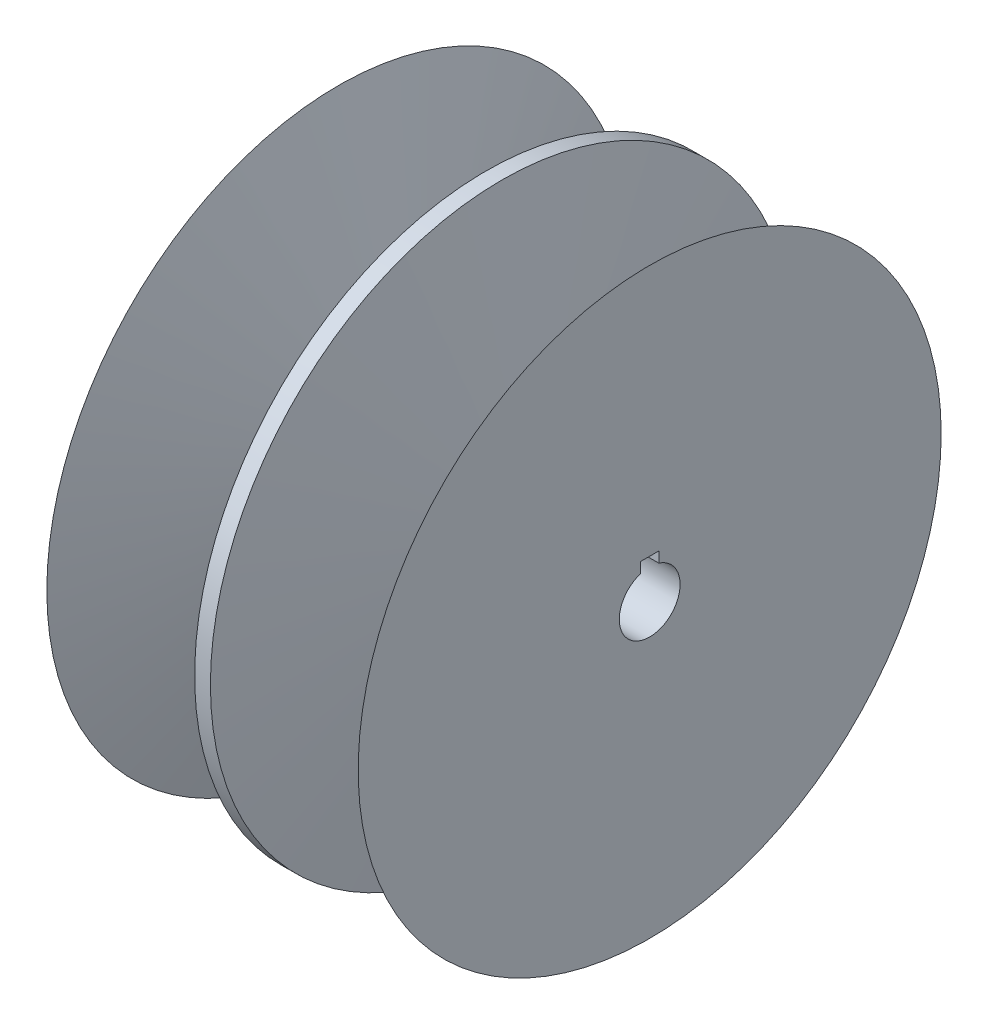
ISO-10303-21;
HEADER;
FILE_DESCRIPTION(('STEP AP214'),'2;1');
FILE_NAME('part.step','',(''),(''),'','','');
FILE_SCHEMA(('AUTOMOTIVE_DESIGN { 1 0 10303 214 1 1 1 1 }'));
ENDSEC;
DATA;
#1=APPLICATION_CONTEXT('core data for automotive mechanical design processes');
#2=APPLICATION_PROTOCOL_DEFINITION('international standard','automotive_design',2000,#1);
#3=PRODUCT_CONTEXT('',#1,'mechanical');
#4=PRODUCT('Part','Part','',(#3));
#5=PRODUCT_RELATED_PRODUCT_CATEGORY('part','',(#4));
#6=PRODUCT_DEFINITION_FORMATION('','',#4);
#7=PRODUCT_DEFINITION_CONTEXT('part definition',#1,'design');
#8=PRODUCT_DEFINITION('design','',#6,#7);
#9=PRODUCT_DEFINITION_SHAPE('','',#8);
#10=(LENGTH_UNIT() NAMED_UNIT(*) SI_UNIT(.MILLI.,.METRE.));
#11=(NAMED_UNIT(*) PLANE_ANGLE_UNIT() SI_UNIT($,.RADIAN.));
#12=(NAMED_UNIT(*) SI_UNIT($,.STERADIAN.) SOLID_ANGLE_UNIT());
#13=UNCERTAINTY_MEASURE_WITH_UNIT(LENGTH_MEASURE(1.E-05),#10,'distance_accuracy_value','');
#14=(GEOMETRIC_REPRESENTATION_CONTEXT(3) GLOBAL_UNCERTAINTY_ASSIGNED_CONTEXT((#13)) GLOBAL_UNIT_ASSIGNED_CONTEXT((#10,
#11,#12)) REPRESENTATION_CONTEXT('',''));
#15=CARTESIAN_POINT('',(0.,0.,0.));
#16=DIRECTION('',(0.,0.,1.));
#17=DIRECTION('',(1.,0.,0.));
#18=AXIS2_PLACEMENT_3D('',#15,#16,#17);
#19=CARTESIAN_POINT('',(40.64,0.,0.));
#20=DIRECTION('',(1.,0.,0.));
#21=DIRECTION('',(0.,0.,-1.));
#22=AXIS2_PLACEMENT_3D('',#19,#20,#21);
#23=PLANE('',#22);
#24=CARTESIAN_POINT('',(40.64,0.,0.));
#25=DIRECTION('',(1.,0.,0.));
#26=DIRECTION('',(0.,0.,-1.));
#27=AXIS2_PLACEMENT_3D('',#24,#25,#26);
#28=CIRCLE('',#27,7.9375);
#29=CARTESIAN_POINT('',(40.64,7.57189241124701,2.38125));
#30=VERTEX_POINT('',#29);
#31=CARTESIAN_POINT('',(40.64,7.57189241124701,-2.38125));
#32=VERTEX_POINT('',#31);
#33=EDGE_CURVE('E57',#30,#32,#28,.T.);
#34=ORIENTED_EDGE('',*,*,#33,.F.);
#35=DIRECTION('',(0.,1.,0.));
#36=VECTOR('',#35,1.);
#37=CARTESIAN_POINT('',(40.64,0.,2.38125));
#38=LINE('',#37,#36);
#39=CARTESIAN_POINT('',(40.64,10.31875,2.38125));
#40=VERTEX_POINT('',#39);
#41=EDGE_CURVE('E100',#30,#40,#38,.T.);
#42=ORIENTED_EDGE('',*,*,#41,.T.);
#43=DIRECTION('',(0.,0.,1.));
#44=VECTOR('',#43,1.);
#45=CARTESIAN_POINT('',(40.64,10.31875,0.));
#46=LINE('',#45,#44);
#47=CARTESIAN_POINT('',(40.64,10.31875,-2.38125));
#48=VERTEX_POINT('',#47);
#49=EDGE_CURVE('E85',#48,#40,#46,.T.);
#50=ORIENTED_EDGE('',*,*,#49,.F.);
#51=DIRECTION('',(0.,1.,0.));
#52=VECTOR('',#51,1.);
#53=CARTESIAN_POINT('',(40.64,0.,-2.38125));
#54=LINE('',#53,#52);
#55=EDGE_CURVE('E94',#32,#48,#54,.T.);
#56=ORIENTED_EDGE('',*,*,#55,.F.);
#57=EDGE_LOOP('',(#34,#42,#50,#56));
#58=FACE_BOUND('',#57,.T.);
#59=CARTESIAN_POINT('',(40.64,0.,0.));
#60=DIRECTION('',(1.,0.,0.));
#61=DIRECTION('',(0.,0.,-1.));
#62=AXIS2_PLACEMENT_3D('',#59,#60,#61);
#63=CIRCLE('',#62,76.09205);
#64=CARTESIAN_POINT('',(40.64,0.,-76.09205));
#65=VERTEX_POINT('',#64);
#66=EDGE_CURVE('E112',#65,#65,#63,.T.);
#67=ORIENTED_EDGE('',*,*,#66,.T.);
#68=EDGE_LOOP('',(#67));
#69=FACE_BOUND('',#68,.T.);
#70=ADVANCED_FACE('F43',(#58,#69),#23,.T.);
#71=CARTESIAN_POINT('',(40.64,0.,0.));
#72=DIRECTION('',(1.,0.,0.));
#73=DIRECTION('',(0.,0.,-1.));
#74=AXIS2_PLACEMENT_3D('',#71,#72,#73);
#75=CONICAL_SURFACE('',#74,76.09205,1.28500702817278);
#76=CARTESIAN_POINT('',(22.0133333333333,0.,0.));
#77=DIRECTION('',(1.,0.,0.));
#78=DIRECTION('',(0.,0.,-1.));
#79=AXIS2_PLACEMENT_3D('',#76,#77,#78);
#80=CIRCLE('',#79,12.7);
#81=CARTESIAN_POINT('',(22.0133333333333,0.,-12.7));
#82=VERTEX_POINT('',#81);
#83=EDGE_CURVE('E107',#82,#82,#80,.T.);
#84=CARTESIAN_POINT('',(22.0133333333333,0.,-12.7));
#85=CARTESIAN_POINT('',(22.2073611111111,0.,-13.3603338541666));
#86=CARTESIAN_POINT('',(22.4013888888889,0.,-14.0206677083333));
#87=CARTESIAN_POINT('',(22.7894444444444,0.,-15.3413354166666));
#88=CARTESIAN_POINT('',(22.9834722222222,0.,-16.0016692708333));
#89=CARTESIAN_POINT('',(23.3715277777778,0.,-17.3223369791666));
#90=CARTESIAN_POINT('',(23.5655555555556,0.,-17.9826708333333));
#91=CARTESIAN_POINT('',(23.9536111111111,0.,-19.3033385416666));
#92=CARTESIAN_POINT('',(24.1476388888889,0.,-19.9636723958333));
#93=CARTESIAN_POINT('',(24.5356944444444,0.,-21.2843401041666));
#94=CARTESIAN_POINT('',(24.7297222222222,0.,-21.9446739583333));
#95=CARTESIAN_POINT('',(25.1177777777778,0.,-23.2653416666666));
#96=CARTESIAN_POINT('',(25.3118055555556,0.,-23.9256755208333));
#97=CARTESIAN_POINT('',(25.6998611111111,0.,-25.2463432291666));
#98=CARTESIAN_POINT('',(25.8938888888889,0.,-25.9066770833333));
#99=CARTESIAN_POINT('',(26.2819444444444,0.,-27.2273447916666));
#100=CARTESIAN_POINT('',(26.4759722222222,0.,-27.8876786458333));
#101=CARTESIAN_POINT('',(26.8640277777778,0.,-29.2083463541666));
#102=CARTESIAN_POINT('',(27.0580555555556,0.,-29.8686802083333));
#103=CARTESIAN_POINT('',(27.4461111111111,0.,-31.1893479166666));
#104=CARTESIAN_POINT('',(27.6401388888889,0.,-31.8496817708333));
#105=CARTESIAN_POINT('',(28.0281944444444,0.,-33.1703494791666));
#106=CARTESIAN_POINT('',(28.2222222222222,0.,-33.8306833333333));
#107=CARTESIAN_POINT('',(28.6102777777778,0.,-35.1513510416666));
#108=CARTESIAN_POINT('',(28.8043055555556,0.,-35.8116848958333));
#109=CARTESIAN_POINT('',(29.1923611111111,0.,-37.1323526041666));
#110=CARTESIAN_POINT('',(29.3863888888889,0.,-37.7926864583333));
#111=CARTESIAN_POINT('',(29.7744444444444,0.,-39.1133541666666));
#112=CARTESIAN_POINT('',(29.9684722222222,0.,-39.7736880208333));
#113=CARTESIAN_POINT('',(30.3565277777778,0.,-41.0943557291666));
#114=CARTESIAN_POINT('',(30.5505555555556,0.,-41.7546895833333));
#115=CARTESIAN_POINT('',(30.9386111111111,0.,-43.0753572916666));
#116=CARTESIAN_POINT('',(31.1326388888889,0.,-43.7356911458333));
#117=CARTESIAN_POINT('',(31.5206944444444,0.,-45.0563588541666));
#118=CARTESIAN_POINT('',(31.7147222222222,0.,-45.7166927083333));
#119=CARTESIAN_POINT('',(32.1027777777778,0.,-47.0373604166666));
#120=CARTESIAN_POINT('',(32.2968055555556,0.,-47.6976942708333));
#121=CARTESIAN_POINT('',(32.6848611111111,0.,-49.0183619791666));
#122=CARTESIAN_POINT('',(32.8788888888889,0.,-49.6786958333333));
#123=CARTESIAN_POINT('',(33.2669444444444,0.,-50.9993635416666));
#124=CARTESIAN_POINT('',(33.4609722222222,0.,-51.6596973958333));
#125=CARTESIAN_POINT('',(33.8490277777778,0.,-52.9803651041666));
#126=CARTESIAN_POINT('',(34.0430555555556,0.,-53.6406989583333));
#127=CARTESIAN_POINT('',(34.4311111111111,0.,-54.9613666666666));
#128=CARTESIAN_POINT('',(34.6251388888889,0.,-55.6217005208333));
#129=CARTESIAN_POINT('',(35.0131944444444,0.,-56.9423682291666));
#130=CARTESIAN_POINT('',(35.2072222222222,0.,-57.6027020833333));
#131=CARTESIAN_POINT('',(35.5952777777778,0.,-58.9233697916666));
#132=CARTESIAN_POINT('',(35.7893055555556,0.,-59.5837036458333));
#133=CARTESIAN_POINT('',(36.1773611111111,0.,-60.9043713541666));
#134=CARTESIAN_POINT('',(36.3713888888889,0.,-61.5647052083333));
#135=CARTESIAN_POINT('',(36.7594444444444,0.,-62.8853729166666));
#136=CARTESIAN_POINT('',(36.9534722222222,0.,-63.5457067708333));
#137=CARTESIAN_POINT('',(37.3415277777778,0.,-64.8663744791666));
#138=CARTESIAN_POINT('',(37.5355555555556,0.,-65.5267083333333));
#139=CARTESIAN_POINT('',(37.9236111111111,0.,-66.8473760416666));
#140=CARTESIAN_POINT('',(38.1176388888889,0.,-67.5077098958333));
#141=CARTESIAN_POINT('',(38.5056944444444,0.,-68.8283776041666));
#142=CARTESIAN_POINT('',(38.6997222222222,0.,-69.4887114583333));
#143=CARTESIAN_POINT('',(39.0877777777778,0.,-70.8093791666666));
#144=CARTESIAN_POINT('',(39.2818055555556,0.,-71.4697130208333));
#145=CARTESIAN_POINT('',(39.6698611111111,0.,-72.7903807291666));
#146=CARTESIAN_POINT('',(39.8638888888889,0.,-73.4507145833333));
#147=CARTESIAN_POINT('',(40.2519444444444,0.,-74.7713822916666));
#148=CARTESIAN_POINT('',(40.4459722222222,0.,-75.4317161458333));
#149=CARTESIAN_POINT('',(40.64,0.,-76.09205));
#150=B_SPLINE_CURVE_WITH_KNOTS('',3,(#84,#85,#86,#87,#88,#89,#90,#91,#92,#93,#94,#95,#96,#97,
#98,#99,#100,#101,#102,#103,#104,#105,#106,#107,#108,#109,#110,#111,#112,#113,#114,#115,#116,
#117,#118,#119,#120,#121,#122,#123,#124,#125,#126,#127,#128,#129,#130,#131,#132,#133,#134,#135,
#136,#137,#138,#139,#140,#141,#142,#143,#144,#145,#146,#147,#148,#149),.UNSPECIFIED.,.F.,.F.,(4,
2,2,2,2,2,2,2,2,2,2,2,2,2,2,2,2,2,2,2,2,2,2,2,2,2,2,2,2,2,2,2,4),(0.,2.06474894298844,
4.12949788597689,6.19424682896533,8.25899577195378,10.3237447149422,12.3884936579307,
14.4532426009191,16.5179915439075,18.582740486896,20.6474894298844,22.7122383728729,
24.7769873158613,26.8417362588498,28.9064852018382,30.9712341448266,33.0359830878151,
35.1007320308035,37.165480973792,39.2302299167804,41.2949788597688,43.3597278027573,
45.4244767457457,47.4892256887342,49.5539746317226,51.618723574711,53.6834725176995,
55.7482214606879,57.8129704036764,59.8777193466648,61.9424682896533,64.0072172326417,
66.0719661756302),.UNSPECIFIED.);
#151=EDGE_CURVE('BSEAM133',#82,#65,#150,.T.);
#152=ORIENTED_EDGE('',*,*,#83,.T.);
#153=ORIENTED_EDGE('',*,*,#66,.F.);
#154=ORIENTED_EDGE('',*,*,#151,.T.);
#155=ORIENTED_EDGE('',*,*,#151,.F.);
#156=EDGE_LOOP('',(#152,#154,#153,#155));
#157=FACE_BOUND('',#156,.T.);
#158=ADVANCED_FACE('F133',(#157),#75,.T.);
#159=CARTESIAN_POINT('',(22.0133333333333,0.,0.));
#160=DIRECTION('',(-1.,0.,0.));
#161=DIRECTION('',(0.,0.,1.));
#162=AXIS2_PLACEMENT_3D('',#159,#160,#161);
#163=PLANE('',#162);
#164=CARTESIAN_POINT('',(22.0133333333333,0.,0.));
#165=DIRECTION('',(-1.,0.,0.));
#166=DIRECTION('',(0.,0.,1.));
#167=AXIS2_PLACEMENT_3D('',#164,#165,#166);
#168=CIRCLE('',#167,7.9375);
#169=CARTESIAN_POINT('',(22.0133333333333,7.57189241124701,-2.38125));
#170=VERTEX_POINT('',#169);
#171=CARTESIAN_POINT('',(22.0133333333333,7.57189241124701,2.38125));
#172=VERTEX_POINT('',#171);
#173=EDGE_CURVE('E12',#170,#172,#168,.T.);
#174=ORIENTED_EDGE('',*,*,#173,.F.);
#175=DIRECTION('',(0.,-1.,0.));
#176=VECTOR('',#175,1.);
#177=CARTESIAN_POINT('',(22.0133333333333,0.,-2.38125));
#178=LINE('',#177,#176);
#179=CARTESIAN_POINT('',(22.0133333333333,10.31875,-2.38125));
#180=VERTEX_POINT('',#179);
#181=EDGE_CURVE('E115',#180,#170,#178,.T.);
#182=ORIENTED_EDGE('',*,*,#181,.F.);
#183=DIRECTION('',(0.,0.,-1.));
#184=VECTOR('',#183,1.);
#185=CARTESIAN_POINT('',(22.0133333333333,10.31875,0.));
#186=LINE('',#185,#184);
#187=CARTESIAN_POINT('',(22.0133333333333,10.31875,2.38125));
#188=VERTEX_POINT('',#187);
#189=EDGE_CURVE('E88',#188,#180,#186,.T.);
#190=ORIENTED_EDGE('',*,*,#189,.F.);
#191=DIRECTION('',(0.,-1.,0.));
#192=VECTOR('',#191,1.);
#193=CARTESIAN_POINT('',(22.0133333333333,0.,2.38125));
#194=LINE('',#193,#192);
#195=EDGE_CURVE('E50',#188,#172,#194,.T.);
#196=ORIENTED_EDGE('',*,*,#195,.T.);
#197=EDGE_LOOP('',(#174,#182,#190,#196));
#198=FACE_BOUND('',#197,.T.);
#199=ORIENTED_EDGE('',*,*,#83,.F.);
#200=EDGE_LOOP('',(#199));
#201=FACE_BOUND('',#200,.T.);
#202=ADVANCED_FACE('F120',(#198,#201),#163,.T.);
#203=CARTESIAN_POINT('',(-67.564,0.,0.));
#204=DIRECTION('',(1.,0.,0.));
#205=DIRECTION('',(0.,0.,-1.));
#206=AXIS2_PLACEMENT_3D('',#203,#204,#205);
#207=CYLINDRICAL_SURFACE('',#206,7.9375);
#208=ORIENTED_EDGE('',*,*,#173,.T.);
#209=DIRECTION('',(1.,0.,0.));
#210=VECTOR('',#209,1.);
#211=CARTESIAN_POINT('',(-67.564,7.57189241124701,2.38125));
#212=LINE('',#211,#210);
#213=EDGE_CURVE('E105',#172,#30,#212,.T.);
#214=ORIENTED_EDGE('',*,*,#213,.T.);
#215=ORIENTED_EDGE('',*,*,#33,.T.);
#216=DIRECTION('',(1.,0.,0.));
#217=VECTOR('',#216,1.);
#218=CARTESIAN_POINT('',(-67.564,7.57189241124701,-2.38125));
#219=LINE('',#218,#217);
#220=EDGE_CURVE('E91',#170,#32,#219,.T.);
#221=ORIENTED_EDGE('',*,*,#220,.F.);
#222=EDGE_LOOP('',(#208,#214,#215,#221));
#223=FACE_BOUND('',#222,.T.);
#224=ADVANCED_FACE('F125',(#223),#207,.F.);
#225=CARTESIAN_POINT('',(-67.564,0.,2.38125));
#226=DIRECTION('',(0.,0.,-1.));
#227=DIRECTION('',(-1.,0.,0.));
#228=AXIS2_PLACEMENT_3D('',#225,#226,#227);
#229=PLANE('',#228);
#230=DIRECTION('',(1.,0.,0.));
#231=VECTOR('',#230,1.);
#232=CARTESIAN_POINT('',(-67.564,10.31875,2.38125));
#233=LINE('',#232,#231);
#234=EDGE_CURVE('E90',#188,#40,#233,.T.);
#235=ORIENTED_EDGE('',*,*,#234,.T.);
#236=ORIENTED_EDGE('',*,*,#41,.F.);
#237=ORIENTED_EDGE('',*,*,#213,.F.);
#238=ORIENTED_EDGE('',*,*,#195,.F.);
#239=EDGE_LOOP('',(#235,#236,#237,#238));
#240=FACE_BOUND('',#239,.T.);
#241=ADVANCED_FACE('F124',(#240),#229,.T.);
#242=CARTESIAN_POINT('',(-67.564,10.31875,0.));
#243=DIRECTION('',(0.,1.,0.));
#244=DIRECTION('',(0.,0.,1.));
#245=AXIS2_PLACEMENT_3D('',#242,#243,#244);
#246=PLANE('',#245);
#247=ORIENTED_EDGE('',*,*,#189,.T.);
#248=DIRECTION('',(1.,0.,0.));
#249=VECTOR('',#248,1.);
#250=CARTESIAN_POINT('',(-67.564,10.31875,-2.38125));
#251=LINE('',#250,#249);
#252=EDGE_CURVE('E65',#180,#48,#251,.T.);
#253=ORIENTED_EDGE('',*,*,#252,.T.);
#254=ORIENTED_EDGE('',*,*,#49,.T.);
#255=ORIENTED_EDGE('',*,*,#234,.F.);
#256=EDGE_LOOP('',(#247,#253,#254,#255));
#257=FACE_BOUND('',#256,.T.);
#258=ADVANCED_FACE('F82',(#257),#246,.F.);
#259=CARTESIAN_POINT('',(-67.564,0.,-2.38125));
#260=DIRECTION('',(0.,0.,-1.));
#261=DIRECTION('',(-1.,0.,0.));
#262=AXIS2_PLACEMENT_3D('',#259,#260,#261);
#263=PLANE('',#262);
#264=ORIENTED_EDGE('',*,*,#181,.T.);
#265=ORIENTED_EDGE('',*,*,#220,.T.);
#266=ORIENTED_EDGE('',*,*,#55,.T.);
#267=ORIENTED_EDGE('',*,*,#252,.F.);
#268=EDGE_LOOP('',(#264,#265,#266,#267));
#269=FACE_BOUND('',#268,.T.);
#270=ADVANCED_FACE('F95',(#269),#263,.F.);
#271=CLOSED_SHELL('',(#70,#158,#202,#224,#241,#258,#270));
#272=MANIFOLD_SOLID_BREP('B2',#271);
#273=CARTESIAN_POINT('',(-9.31333333333333,0.,0.));
#274=DIRECTION('',(1.,0.,0.));
#275=DIRECTION('',(0.,0.,-1.));
#276=AXIS2_PLACEMENT_3D('',#273,#274,#275);
#277=CONICAL_SURFACE('',#276,12.7,1.45683104973889);
#278=CARTESIAN_POINT('',(-2.0574,0.,0.));
#279=DIRECTION('',(1.,0.,0.));
#280=DIRECTION('',(0.,0.,-1.));
#281=AXIS2_PLACEMENT_3D('',#278,#279,#280);
#282=CIRCLE('',#281,76.09205);
#283=CARTESIAN_POINT('',(-2.0574,0.,-76.09205));
#284=VERTEX_POINT('',#283);
#285=EDGE_CURVE('E252',#284,#284,#282,.T.);
#286=CARTESIAN_POINT('',(-9.31333333333333,0.,0.));
#287=DIRECTION('',(1.,0.,0.));
#288=DIRECTION('',(0.,0.,-1.));
#289=AXIS2_PLACEMENT_3D('',#286,#287,#288);
#290=CIRCLE('',#289,12.7);
#291=CARTESIAN_POINT('',(-9.31333333333333,0.,-12.7));
#292=VERTEX_POINT('',#291);
#293=EDGE_CURVE('E265',#292,#292,#290,.T.);
#294=CARTESIAN_POINT('',(-2.0574,0.,-76.09205));
#295=CARTESIAN_POINT('',(-2.13298263888889,0.,-75.4317161458334));
#296=CARTESIAN_POINT('',(-2.20856527777778,0.,-74.7713822916667));
#297=CARTESIAN_POINT('',(-2.35973055555556,0.,-73.4507145833334));
#298=CARTESIAN_POINT('',(-2.43531319444445,0.,-72.7903807291667));
#299=CARTESIAN_POINT('',(-2.58647847222222,0.,-71.4697130208334));
#300=CARTESIAN_POINT('',(-2.66206111111111,0.,-70.8093791666667));
#301=CARTESIAN_POINT('',(-2.81322638888889,0.,-69.4887114583334));
#302=CARTESIAN_POINT('',(-2.88880902777778,0.,-68.8283776041667));
#303=CARTESIAN_POINT('',(-3.03997430555556,0.,-67.5077098958334));
#304=CARTESIAN_POINT('',(-3.11555694444445,0.,-66.8473760416667));
#305=CARTESIAN_POINT('',(-3.26672222222222,0.,-65.5267083333334));
#306=CARTESIAN_POINT('',(-3.34230486111111,0.,-64.8663744791667));
#307=CARTESIAN_POINT('',(-3.49347013888889,0.,-63.5457067708333));
#308=CARTESIAN_POINT('',(-3.56905277777778,0.,-62.8853729166667));
#309=CARTESIAN_POINT('',(-3.72021805555556,0.,-61.5647052083334));
#310=CARTESIAN_POINT('',(-3.79580069444445,0.,-60.9043713541667));
#311=CARTESIAN_POINT('',(-3.94696597222222,0.,-59.5837036458334));
#312=CARTESIAN_POINT('',(-4.02254861111111,0.,-58.9233697916667));
#313=CARTESIAN_POINT('',(-4.17371388888889,0.,-57.6027020833333));
#314=CARTESIAN_POINT('',(-4.24929652777778,0.,-56.9423682291667));
#315=CARTESIAN_POINT('',(-4.40046180555556,0.,-55.6217005208333));
#316=CARTESIAN_POINT('',(-4.47604444444444,0.,-54.9613666666667));
#317=CARTESIAN_POINT('',(-4.62720972222222,0.,-53.6406989583334));
#318=CARTESIAN_POINT('',(-4.70279236111111,0.,-52.9803651041667));
#319=CARTESIAN_POINT('',(-4.85395763888889,0.,-51.6596973958333));
#320=CARTESIAN_POINT('',(-4.92954027777778,0.,-50.9993635416667));
#321=CARTESIAN_POINT('',(-5.08070555555556,0.,-49.6786958333334));
#322=CARTESIAN_POINT('',(-5.15628819444445,0.,-49.0183619791667));
#323=CARTESIAN_POINT('',(-5.30745347222222,0.,-47.6976942708333));
#324=CARTESIAN_POINT('',(-5.38303611111111,0.,-47.0373604166667));
#325=CARTESIAN_POINT('',(-5.53420138888889,0.,-45.7166927083333));
#326=CARTESIAN_POINT('',(-5.60978402777778,0.,-45.0563588541667));
#327=CARTESIAN_POINT('',(-5.76094930555556,0.,-43.7356911458333));
#328=CARTESIAN_POINT('',(-5.83653194444445,0.,-43.0753572916667));
#329=CARTESIAN_POINT('',(-5.98769722222222,0.,-41.7546895833333));
#330=CARTESIAN_POINT('',(-6.06327986111111,0.,-41.0943557291667));
#331=CARTESIAN_POINT('',(-6.21444513888889,0.,-39.7736880208333));
#332=CARTESIAN_POINT('',(-6.29002777777778,0.,-39.1133541666667));
#333=CARTESIAN_POINT('',(-6.44119305555556,0.,-37.7926864583333));
#334=CARTESIAN_POINT('',(-6.51677569444445,0.,-37.1323526041667));
#335=CARTESIAN_POINT('',(-6.66794097222222,0.,-35.8116848958333));
#336=CARTESIAN_POINT('',(-6.74352361111111,0.,-35.1513510416667));
#337=CARTESIAN_POINT('',(-6.89468888888889,0.,-33.8306833333333));
#338=CARTESIAN_POINT('',(-6.97027152777778,0.,-33.1703494791667));
#339=CARTESIAN_POINT('',(-7.12143680555556,0.,-31.8496817708333));
#340=CARTESIAN_POINT('',(-7.19701944444444,0.,-31.1893479166667));
#341=CARTESIAN_POINT('',(-7.34818472222222,0.,-29.8686802083333));
#342=CARTESIAN_POINT('',(-7.42376736111111,0.,-29.2083463541667));
#343=CARTESIAN_POINT('',(-7.57493263888889,0.,-27.8876786458333));
#344=CARTESIAN_POINT('',(-7.65051527777778,0.,-27.2273447916667));
#345=CARTESIAN_POINT('',(-7.80168055555556,0.,-25.9066770833333));
#346=CARTESIAN_POINT('',(-7.87726319444444,0.,-25.2463432291667));
#347=CARTESIAN_POINT('',(-8.02842847222222,0.,-23.9256755208333));
#348=CARTESIAN_POINT('',(-8.10401111111111,0.,-23.2653416666667));
#349=CARTESIAN_POINT('',(-8.25517638888889,0.,-21.9446739583333));
#350=CARTESIAN_POINT('',(-8.33075902777778,0.,-21.2843401041667));
#351=CARTESIAN_POINT('',(-8.48192430555556,0.,-19.9636723958333));
#352=CARTESIAN_POINT('',(-8.55750694444444,0.,-19.3033385416667));
#353=CARTESIAN_POINT('',(-8.70867222222222,0.,-17.9826708333333));
#354=CARTESIAN_POINT('',(-8.78425486111111,0.,-17.3223369791667));
#355=CARTESIAN_POINT('',(-8.93542013888889,0.,-16.0016692708333));
#356=CARTESIAN_POINT('',(-9.01100277777778,0.,-15.3413354166667));
#357=CARTESIAN_POINT('',(-9.16216805555556,0.,-14.0206677083333));
#358=CARTESIAN_POINT('',(-9.23775069444444,0.,-13.3603338541667));
#359=CARTESIAN_POINT('',(-9.31333333333333,0.,-12.7));
#360=B_SPLINE_CURVE_WITH_KNOTS('',3,(#294,#295,#296,#297,#298,#299,#300,#301,#302,#303,#304,
#305,#306,#307,#308,#309,#310,#311,#312,#313,#314,#315,#316,#317,#318,#319,#320,#321,#322,#323,
#324,#325,#326,#327,#328,#329,#330,#331,#332,#333,#334,#335,#336,#337,#338,#339,#340,#341,#342,
#343,#344,#345,#346,#347,#348,#349,#350,#351,#352,#353,#354,#355,#356,#357,#358,#359),
.UNSPECIFIED.,.F.,.F.,(4,2,2,2,2,2,2,2,2,2,2,2,2,2,2,2,2,2,2,2,2,2,2,2,2,2,2,2,2,2,2,2,4),(0.,
1.99393625984887,3.98787251969776,5.98180877954662,7.9757450393955,9.96968129924437,
11.9636175590933,13.9575538189421,15.951490078791,17.9454263386399,19.9393625984888,
21.9332988583376,23.9272351181865,25.9211713780354,27.9151076378843,29.9090438977331,
31.902980157582,33.8969164174309,35.8908526772797,37.8847889371286,39.8787251969775,
41.8726614568264,43.8665977166752,45.8605339765241,47.854470236373,49.8484064962219,
51.8423427560707,53.8362790159196,55.8302152757685,57.8241515356174,59.8180877954662,
61.8120240553151,63.805960315164),.UNSPECIFIED.);
#361=EDGE_CURVE('BSEAM196',#284,#292,#360,.T.);
#362=ORIENTED_EDGE('',*,*,#285,.F.);
#363=ORIENTED_EDGE('',*,*,#293,.T.);
#364=ORIENTED_EDGE('',*,*,#361,.T.);
#365=ORIENTED_EDGE('',*,*,#361,.F.);
#366=EDGE_LOOP('',(#362,#364,#363,#365));
#367=FACE_BOUND('',#366,.T.);
#368=ADVANCED_FACE('F196',(#367),#277,.T.);
#369=CARTESIAN_POINT('',(-9.31333333333333,0.,0.));
#370=DIRECTION('',(-1.,0.,0.));
#371=DIRECTION('',(0.,0.,1.));
#372=AXIS2_PLACEMENT_3D('',#369,#370,#371);
#373=PLANE('',#372);
#374=CARTESIAN_POINT('',(-9.31333333333333,0.,0.));
#375=DIRECTION('',(-1.,0.,0.));
#376=DIRECTION('',(0.,0.,1.));
#377=AXIS2_PLACEMENT_3D('',#374,#375,#376);
#378=CIRCLE('',#377,7.9375);
#379=CARTESIAN_POINT('',(-9.31333333333333,7.57189241124701,-2.38125));
#380=VERTEX_POINT('',#379);
#381=CARTESIAN_POINT('',(-9.31333333333333,7.57189241124701,2.38125));
#382=VERTEX_POINT('',#381);
#383=EDGE_CURVE('E244',#380,#382,#378,.T.);
#384=ORIENTED_EDGE('',*,*,#383,.F.);
#385=DIRECTION('',(0.,-1.,0.));
#386=VECTOR('',#385,1.);
#387=CARTESIAN_POINT('',(-9.31333333333333,0.,-2.38125));
#388=LINE('',#387,#386);
#389=CARTESIAN_POINT('',(-9.31333333333333,10.31875,-2.38125));
#390=VERTEX_POINT('',#389);
#391=EDGE_CURVE('E233',#390,#380,#388,.T.);
#392=ORIENTED_EDGE('',*,*,#391,.F.);
#393=DIRECTION('',(0.,0.,-1.));
#394=VECTOR('',#393,1.);
#395=CARTESIAN_POINT('',(-9.31333333333333,10.31875,0.));
#396=LINE('',#395,#394);
#397=CARTESIAN_POINT('',(-9.31333333333333,10.31875,2.38125));
#398=VERTEX_POINT('',#397);
#399=EDGE_CURVE('E238',#398,#390,#396,.T.);
#400=ORIENTED_EDGE('',*,*,#399,.F.);
#401=DIRECTION('',(0.,-1.,0.));
#402=VECTOR('',#401,1.);
#403=CARTESIAN_POINT('',(-9.31333333333333,0.,2.38125));
#404=LINE('',#403,#402);
#405=EDGE_CURVE('E251',#398,#382,#404,.T.);
#406=ORIENTED_EDGE('',*,*,#405,.T.);
#407=EDGE_LOOP('',(#384,#392,#400,#406));
#408=FACE_BOUND('',#407,.T.);
#409=ORIENTED_EDGE('',*,*,#293,.F.);
#410=EDGE_LOOP('',(#409));
#411=FACE_BOUND('',#410,.T.);
#412=ADVANCED_FACE('F249',(#408,#411),#373,.T.);
#413=CARTESIAN_POINT('',(9.31333333333333,0.,0.));
#414=DIRECTION('',(-1.,0.,0.));
#415=DIRECTION('',(0.,0.,1.));
#416=AXIS2_PLACEMENT_3D('',#413,#414,#415);
#417=PLANE('',#416);
#418=DIRECTION('',(0.,-1.,0.));
#419=VECTOR('',#418,1.);
#420=CARTESIAN_POINT('',(9.31333333333333,0.,-2.38125));
#421=LINE('',#420,#419);
#422=CARTESIAN_POINT('',(9.31333333333334,10.31875,-2.38125));
#423=VERTEX_POINT('',#422);
#424=CARTESIAN_POINT('',(9.31333333333333,7.57189241124701,-2.38125));
#425=VERTEX_POINT('',#424);
#426=EDGE_CURVE('E268',#423,#425,#421,.T.);
#427=ORIENTED_EDGE('',*,*,#426,.T.);
#428=CARTESIAN_POINT('',(9.31333333333334,0.,0.));
#429=DIRECTION('',(-1.,0.,0.));
#430=DIRECTION('',(0.,0.,1.));
#431=AXIS2_PLACEMENT_3D('',#428,#429,#430);
#432=CIRCLE('',#431,7.9375);
#433=CARTESIAN_POINT('',(9.31333333333334,7.57189241124701,2.38125));
#434=VERTEX_POINT('',#433);
#435=EDGE_CURVE('E41',#425,#434,#432,.T.);
#436=ORIENTED_EDGE('',*,*,#435,.T.);
#437=DIRECTION('',(0.,-1.,0.));
#438=VECTOR('',#437,1.);
#439=CARTESIAN_POINT('',(9.31333333333333,0.,2.38125));
#440=LINE('',#439,#438);
#441=CARTESIAN_POINT('',(9.31333333333334,10.31875,2.38125));
#442=VERTEX_POINT('',#441);
#443=EDGE_CURVE('E203',#442,#434,#440,.T.);
#444=ORIENTED_EDGE('',*,*,#443,.F.);
#445=DIRECTION('',(0.,0.,-1.));
#446=VECTOR('',#445,1.);
#447=CARTESIAN_POINT('',(9.31333333333333,10.31875,0.));
#448=LINE('',#447,#446);
#449=EDGE_CURVE('E270',#442,#423,#448,.T.);
#450=ORIENTED_EDGE('',*,*,#449,.T.);
#451=EDGE_LOOP('',(#427,#436,#444,#450));
#452=FACE_BOUND('',#451,.T.);
#453=CARTESIAN_POINT('',(9.31333333333333,0.,0.));
#454=DIRECTION('',(1.,0.,0.));
#455=DIRECTION('',(0.,0.,-1.));
#456=AXIS2_PLACEMENT_3D('',#453,#454,#455);
#457=CIRCLE('',#456,12.7);
#458=CARTESIAN_POINT('',(9.31333333333333,0.,12.7));
#459=VERTEX_POINT('',#458);
#460=EDGE_CURVE('E262',#459,#459,#457,.T.);
#461=ORIENTED_EDGE('',*,*,#460,.T.);
#462=EDGE_LOOP('',(#461));
#463=FACE_BOUND('',#462,.T.);
#464=ADVANCED_FACE('F280',(#452,#463),#417,.F.);
#465=CARTESIAN_POINT('',(9.31333333333333,0.,0.));
#466=DIRECTION('',(-1.,0.,0.));
#467=DIRECTION('',(0.,0.,1.));
#468=AXIS2_PLACEMENT_3D('',#465,#466,#467);
#469=CONICAL_SURFACE('',#468,12.7,1.45683104973889);
#470=CARTESIAN_POINT('',(2.0574,0.,0.));
#471=DIRECTION('',(1.,0.,0.));
#472=DIRECTION('',(0.,0.,-1.));
#473=AXIS2_PLACEMENT_3D('',#470,#471,#472);
#474=CIRCLE('',#473,76.09205);
#475=CARTESIAN_POINT('',(2.0574,0.,76.09205));
#476=VERTEX_POINT('',#475);
#477=EDGE_CURVE('E255',#476,#476,#474,.T.);
#478=CARTESIAN_POINT('',(2.0574,0.,76.09205));
#479=CARTESIAN_POINT('',(2.13298263888889,0.,75.4317161458334));
#480=CARTESIAN_POINT('',(2.20856527777778,0.,74.7713822916667));
#481=CARTESIAN_POINT('',(2.35973055555555,0.,73.4507145833334));
#482=CARTESIAN_POINT('',(2.43531319444444,0.,72.7903807291667));
#483=CARTESIAN_POINT('',(2.58647847222222,0.,71.4697130208334));
#484=CARTESIAN_POINT('',(2.66206111111111,0.,70.8093791666667));
#485=CARTESIAN_POINT('',(2.81322638888889,0.,69.4887114583334));
#486=CARTESIAN_POINT('',(2.88880902777778,0.,68.8283776041667));
#487=CARTESIAN_POINT('',(3.03997430555555,0.,67.5077098958334));
#488=CARTESIAN_POINT('',(3.11555694444444,0.,66.8473760416667));
#489=CARTESIAN_POINT('',(3.26672222222222,0.,65.5267083333334));
#490=CARTESIAN_POINT('',(3.34230486111111,0.,64.8663744791667));
#491=CARTESIAN_POINT('',(3.49347013888889,0.,63.5457067708334));
#492=CARTESIAN_POINT('',(3.56905277777778,0.,62.8853729166667));
#493=CARTESIAN_POINT('',(3.72021805555555,0.,61.5647052083334));
#494=CARTESIAN_POINT('',(3.79580069444444,0.,60.9043713541667));
#495=CARTESIAN_POINT('',(3.94696597222222,0.,59.5837036458334));
#496=CARTESIAN_POINT('',(4.02254861111111,0.,58.9233697916667));
#497=CARTESIAN_POINT('',(4.17371388888889,0.,57.6027020833334));
#498=CARTESIAN_POINT('',(4.24929652777778,0.,56.9423682291667));
#499=CARTESIAN_POINT('',(4.40046180555555,0.,55.6217005208334));
#500=CARTESIAN_POINT('',(4.47604444444444,0.,54.9613666666667));
#501=CARTESIAN_POINT('',(4.62720972222222,0.,53.6406989583334));
#502=CARTESIAN_POINT('',(4.70279236111111,0.,52.9803651041667));
#503=CARTESIAN_POINT('',(4.85395763888889,0.,51.6596973958334));
#504=CARTESIAN_POINT('',(4.92954027777778,0.,50.9993635416667));
#505=CARTESIAN_POINT('',(5.08070555555555,0.,49.6786958333334));
#506=CARTESIAN_POINT('',(5.15628819444444,0.,49.0183619791667));
#507=CARTESIAN_POINT('',(5.30745347222222,0.,47.6976942708334));
#508=CARTESIAN_POINT('',(5.38303611111111,0.,47.0373604166667));
#509=CARTESIAN_POINT('',(5.53420138888889,0.,45.7166927083334));
#510=CARTESIAN_POINT('',(5.60978402777778,0.,45.0563588541667));
#511=CARTESIAN_POINT('',(5.76094930555555,0.,43.7356911458334));
#512=CARTESIAN_POINT('',(5.83653194444444,0.,43.0753572916667));
#513=CARTESIAN_POINT('',(5.98769722222222,0.,41.7546895833334));
#514=CARTESIAN_POINT('',(6.06327986111111,0.,41.0943557291667));
#515=CARTESIAN_POINT('',(6.21444513888889,0.,39.7736880208334));
#516=CARTESIAN_POINT('',(6.29002777777778,0.,39.1133541666667));
#517=CARTESIAN_POINT('',(6.44119305555555,0.,37.7926864583334));
#518=CARTESIAN_POINT('',(6.51677569444444,0.,37.1323526041667));
#519=CARTESIAN_POINT('',(6.66794097222222,0.,35.8116848958333));
#520=CARTESIAN_POINT('',(6.74352361111111,0.,35.1513510416667));
#521=CARTESIAN_POINT('',(6.89468888888889,0.,33.8306833333334));
#522=CARTESIAN_POINT('',(6.97027152777778,0.,33.1703494791667));
#523=CARTESIAN_POINT('',(7.12143680555555,0.,31.8496817708334));
#524=CARTESIAN_POINT('',(7.19701944444444,0.,31.1893479166667));
#525=CARTESIAN_POINT('',(7.34818472222222,0.,29.8686802083333));
#526=CARTESIAN_POINT('',(7.42376736111111,0.,29.2083463541667));
#527=CARTESIAN_POINT('',(7.57493263888889,0.,27.8876786458333));
#528=CARTESIAN_POINT('',(7.65051527777778,0.,27.2273447916667));
#529=CARTESIAN_POINT('',(7.80168055555555,0.,25.9066770833333));
#530=CARTESIAN_POINT('',(7.87726319444444,0.,25.2463432291667));
#531=CARTESIAN_POINT('',(8.02842847222222,0.,23.9256755208333));
#532=CARTESIAN_POINT('',(8.10401111111111,0.,23.2653416666667));
#533=CARTESIAN_POINT('',(8.25517638888889,0.,21.9446739583333));
#534=CARTESIAN_POINT('',(8.33075902777778,0.,21.2843401041667));
#535=CARTESIAN_POINT('',(8.48192430555556,0.,19.9636723958333));
#536=CARTESIAN_POINT('',(8.55750694444444,0.,19.3033385416667));
#537=CARTESIAN_POINT('',(8.70867222222222,0.,17.9826708333333));
#538=CARTESIAN_POINT('',(8.78425486111111,0.,17.3223369791667));
#539=CARTESIAN_POINT('',(8.93542013888889,0.,16.0016692708333));
#540=CARTESIAN_POINT('',(9.01100277777778,0.,15.3413354166667));
#541=CARTESIAN_POINT('',(9.16216805555555,0.,14.0206677083333));
#542=CARTESIAN_POINT('',(9.23775069444444,0.,13.3603338541667));
#543=CARTESIAN_POINT('',(9.31333333333333,0.,12.7));
#544=B_SPLINE_CURVE_WITH_KNOTS('',3,(#478,#479,#480,#481,#482,#483,#484,#485,#486,#487,#488,
#489,#490,#491,#492,#493,#494,#495,#496,#497,#498,#499,#500,#501,#502,#503,#504,#505,#506,#507,
#508,#509,#510,#511,#512,#513,#514,#515,#516,#517,#518,#519,#520,#521,#522,#523,#524,#525,#526,
#527,#528,#529,#530,#531,#532,#533,#534,#535,#536,#537,#538,#539,#540,#541,#542,#543),
.UNSPECIFIED.,.F.,.F.,(4,2,2,2,2,2,2,2,2,2,2,2,2,2,2,2,2,2,2,2,2,2,2,2,2,2,2,2,2,2,2,2,4),(0.,
1.99393625984887,3.98787251969775,5.98180877954662,7.9757450393955,9.96968129924437,
11.9636175590932,13.9575538189421,15.951490078791,17.9454263386399,19.9393625984888,
21.9332988583376,23.9272351181865,25.9211713780354,27.9151076378842,29.9090438977331,
31.902980157582,33.8969164174309,35.8908526772797,37.8847889371286,39.8787251969775,
41.8726614568264,43.8665977166752,45.8605339765241,47.854470236373,49.8484064962219,
51.8423427560707,53.8362790159196,55.8302152757685,57.8241515356174,59.8180877954662,
61.8120240553151,63.805960315164),.UNSPECIFIED.);
#545=EDGE_CURVE('BSEAM306',#476,#459,#544,.T.);
#546=ORIENTED_EDGE('',*,*,#477,.T.);
#547=ORIENTED_EDGE('',*,*,#460,.F.);
#548=ORIENTED_EDGE('',*,*,#545,.T.);
#549=ORIENTED_EDGE('',*,*,#545,.F.);
#550=EDGE_LOOP('',(#546,#548,#547,#549));
#551=FACE_BOUND('',#550,.T.);
#552=ADVANCED_FACE('F306',(#551),#469,.T.);
#553=CARTESIAN_POINT('',(0.,0.,0.));
#554=DIRECTION('',(1.,0.,0.));
#555=DIRECTION('',(0.,0.,-1.));
#556=AXIS2_PLACEMENT_3D('',#553,#554,#555);
#557=CYLINDRICAL_SURFACE('',#556,76.09205);
#558=ORIENTED_EDGE('',*,*,#285,.T.);
#559=EDGE_LOOP('',(#558));
#560=FACE_BOUND('',#559,.T.);
#561=ORIENTED_EDGE('',*,*,#477,.F.);
#562=EDGE_LOOP('',(#561));
#563=FACE_BOUND('',#562,.T.);
#564=ADVANCED_FACE('F303',(#560,#563),#557,.T.);
#565=CARTESIAN_POINT('',(-67.564,0.,0.));
#566=DIRECTION('',(1.,0.,0.));
#567=DIRECTION('',(0.,0.,-1.));
#568=AXIS2_PLACEMENT_3D('',#565,#566,#567);
#569=CYLINDRICAL_SURFACE('',#568,7.9375);
#570=ORIENTED_EDGE('',*,*,#383,.T.);
#571=DIRECTION('',(1.,0.,0.));
#572=VECTOR('',#571,1.);
#573=CARTESIAN_POINT('',(-67.564,7.57189241124701,2.38125));
#574=LINE('',#573,#572);
#575=EDGE_CURVE('E239',#382,#434,#574,.T.);
#576=ORIENTED_EDGE('',*,*,#575,.T.);
#577=ORIENTED_EDGE('',*,*,#435,.F.);
#578=DIRECTION('',(1.,0.,0.));
#579=VECTOR('',#578,1.);
#580=CARTESIAN_POINT('',(-67.564,7.57189241124701,-2.38125));
#581=LINE('',#580,#579);
#582=EDGE_CURVE('E215',#380,#425,#581,.T.);
#583=ORIENTED_EDGE('',*,*,#582,.F.);
#584=EDGE_LOOP('',(#570,#576,#577,#583));
#585=FACE_BOUND('',#584,.T.);
#586=ADVANCED_FACE('F242',(#585),#569,.F.);
#587=CARTESIAN_POINT('',(-67.564,0.,2.38125));
#588=DIRECTION('',(0.,0.,-1.));
#589=DIRECTION('',(-1.,0.,0.));
#590=AXIS2_PLACEMENT_3D('',#587,#588,#589);
#591=PLANE('',#590);
#592=DIRECTION('',(1.,0.,0.));
#593=VECTOR('',#592,1.);
#594=CARTESIAN_POINT('',(-67.564,10.31875,2.38125));
#595=LINE('',#594,#593);
#596=EDGE_CURVE('E277',#398,#442,#595,.T.);
#597=ORIENTED_EDGE('',*,*,#596,.T.);
#598=ORIENTED_EDGE('',*,*,#443,.T.);
#599=ORIENTED_EDGE('',*,*,#575,.F.);
#600=ORIENTED_EDGE('',*,*,#405,.F.);
#601=EDGE_LOOP('',(#597,#598,#599,#600));
#602=FACE_BOUND('',#601,.T.);
#603=ADVANCED_FACE('F275',(#602),#591,.T.);
#604=CARTESIAN_POINT('',(-67.564,10.31875,0.));
#605=DIRECTION('',(0.,1.,0.));
#606=DIRECTION('',(0.,0.,1.));
#607=AXIS2_PLACEMENT_3D('',#604,#605,#606);
#608=PLANE('',#607);
#609=ORIENTED_EDGE('',*,*,#399,.T.);
#610=DIRECTION('',(1.,0.,0.));
#611=VECTOR('',#610,1.);
#612=CARTESIAN_POINT('',(-67.564,10.31875,-2.38125));
#613=LINE('',#612,#611);
#614=EDGE_CURVE('E210',#390,#423,#613,.T.);
#615=ORIENTED_EDGE('',*,*,#614,.T.);
#616=ORIENTED_EDGE('',*,*,#449,.F.);
#617=ORIENTED_EDGE('',*,*,#596,.F.);
#618=EDGE_LOOP('',(#609,#615,#616,#617));
#619=FACE_BOUND('',#618,.T.);
#620=ADVANCED_FACE('F283',(#619),#608,.F.);
#621=CARTESIAN_POINT('',(-67.564,0.,-2.38125));
#622=DIRECTION('',(0.,0.,-1.));
#623=DIRECTION('',(-1.,0.,0.));
#624=AXIS2_PLACEMENT_3D('',#621,#622,#623);
#625=PLANE('',#624);
#626=ORIENTED_EDGE('',*,*,#391,.T.);
#627=ORIENTED_EDGE('',*,*,#582,.T.);
#628=ORIENTED_EDGE('',*,*,#426,.F.);
#629=ORIENTED_EDGE('',*,*,#614,.F.);
#630=EDGE_LOOP('',(#626,#627,#628,#629));
#631=FACE_BOUND('',#630,.T.);
#632=ADVANCED_FACE('F234',(#631),#625,.F.);
#633=CLOSED_SHELL('',(#368,#412,#464,#552,#564,#586,#603,#620,#632));
#634=MANIFOLD_SOLID_BREP('B6',#633);
#635=CARTESIAN_POINT('',(-22.0133333333333,0.,0.));
#636=DIRECTION('',(-1.,0.,0.));
#637=DIRECTION('',(0.,0.,1.));
#638=AXIS2_PLACEMENT_3D('',#635,#636,#637);
#639=PLANE('',#638);
#640=DIRECTION('',(0.,-1.,0.));
#641=VECTOR('',#640,1.);
#642=CARTESIAN_POINT('',(-22.0133333333333,0.,-2.38125));
#643=LINE('',#642,#641);
#644=CARTESIAN_POINT('',(-22.0133333333333,10.31875,-2.38125));
#645=VERTEX_POINT('',#644);
#646=CARTESIAN_POINT('',(-22.0133333333333,7.57189241124701,-2.38125));
#647=VERTEX_POINT('',#646);
#648=EDGE_CURVE('E441',#645,#647,#643,.T.);
#649=ORIENTED_EDGE('',*,*,#648,.T.);
#650=CARTESIAN_POINT('',(-22.0133333333333,0.,0.));
#651=DIRECTION('',(-1.,0.,0.));
#652=DIRECTION('',(0.,0.,1.));
#653=AXIS2_PLACEMENT_3D('',#650,#651,#652);
#654=CIRCLE('',#653,7.9375);
#655=CARTESIAN_POINT('',(-22.0133333333333,7.57189241124701,2.38125));
#656=VERTEX_POINT('',#655);
#657=EDGE_CURVE('E419',#647,#656,#654,.T.);
#658=ORIENTED_EDGE('',*,*,#657,.T.);
#659=DIRECTION('',(0.,-1.,0.));
#660=VECTOR('',#659,1.);
#661=CARTESIAN_POINT('',(-22.0133333333333,0.,2.38125));
#662=LINE('',#661,#660);
#663=CARTESIAN_POINT('',(-22.0133333333333,10.31875,2.38125));
#664=VERTEX_POINT('',#663);
#665=EDGE_CURVE('E436',#664,#656,#662,.T.);
#666=ORIENTED_EDGE('',*,*,#665,.F.);
#667=DIRECTION('',(0.,0.,-1.));
#668=VECTOR('',#667,1.);
#669=CARTESIAN_POINT('',(-22.0133333333333,10.31875,0.));
#670=LINE('',#669,#668);
#671=EDGE_CURVE('E438',#664,#645,#670,.T.);
#672=ORIENTED_EDGE('',*,*,#671,.T.);
#673=EDGE_LOOP('',(#649,#658,#666,#672));
#674=FACE_BOUND('',#673,.T.);
#675=CARTESIAN_POINT('',(-22.0133333333333,0.,0.));
#676=DIRECTION('',(1.,0.,0.));
#677=DIRECTION('',(0.,0.,-1.));
#678=AXIS2_PLACEMENT_3D('',#675,#676,#677);
#679=CIRCLE('',#678,12.7);
#680=CARTESIAN_POINT('',(-22.0133333333333,0.,12.7));
#681=VERTEX_POINT('',#680);
#682=EDGE_CURVE('E412',#681,#681,#679,.T.);
#683=ORIENTED_EDGE('',*,*,#682,.T.);
#684=EDGE_LOOP('',(#683));
#685=FACE_BOUND('',#684,.T.);
#686=ADVANCED_FACE('F370',(#674,#685),#639,.F.);
#687=CARTESIAN_POINT('',(-40.64,0.,0.));
#688=DIRECTION('',(-1.,0.,0.));
#689=DIRECTION('',(0.,0.,1.));
#690=AXIS2_PLACEMENT_3D('',#687,#688,#689);
#691=CONICAL_SURFACE('',#690,76.09205,1.28500702817278);
#692=CARTESIAN_POINT('',(-40.64,0.,0.));
#693=DIRECTION('',(1.,0.,0.));
#694=DIRECTION('',(0.,0.,-1.));
#695=AXIS2_PLACEMENT_3D('',#692,#693,#694);
#696=CIRCLE('',#695,76.09205);
#697=CARTESIAN_POINT('',(-40.64,0.,76.09205));
#698=VERTEX_POINT('',#697);
#699=EDGE_CURVE('E432',#698,#698,#696,.T.);
#700=CARTESIAN_POINT('',(-22.0133333333333,0.,12.7));
#701=CARTESIAN_POINT('',(-22.2073611111111,0.,13.3603338541667));
#702=CARTESIAN_POINT('',(-22.4013888888889,0.,14.0206677083333));
#703=CARTESIAN_POINT('',(-22.7894444444444,0.,15.3413354166667));
#704=CARTESIAN_POINT('',(-22.9834722222222,0.,16.0016692708333));
#705=CARTESIAN_POINT('',(-23.3715277777778,0.,17.3223369791667));
#706=CARTESIAN_POINT('',(-23.5655555555556,0.,17.9826708333333));
#707=CARTESIAN_POINT('',(-23.9536111111111,0.,19.3033385416667));
#708=CARTESIAN_POINT('',(-24.1476388888889,0.,19.9636723958333));
#709=CARTESIAN_POINT('',(-24.5356944444444,0.,21.2843401041667));
#710=CARTESIAN_POINT('',(-24.7297222222222,0.,21.9446739583333));
#711=CARTESIAN_POINT('',(-25.1177777777778,0.,23.2653416666667));
#712=CARTESIAN_POINT('',(-25.3118055555556,0.,23.9256755208333));
#713=CARTESIAN_POINT('',(-25.6998611111111,0.,25.2463432291667));
#714=CARTESIAN_POINT('',(-25.8938888888889,0.,25.9066770833333));
#715=CARTESIAN_POINT('',(-26.2819444444444,0.,27.2273447916667));
#716=CARTESIAN_POINT('',(-26.4759722222222,0.,27.8876786458333));
#717=CARTESIAN_POINT('',(-26.8640277777778,0.,29.2083463541667));
#718=CARTESIAN_POINT('',(-27.0580555555556,0.,29.8686802083333));
#719=CARTESIAN_POINT('',(-27.4461111111111,0.,31.1893479166667));
#720=CARTESIAN_POINT('',(-27.6401388888889,0.,31.8496817708333));
#721=CARTESIAN_POINT('',(-28.0281944444444,0.,33.1703494791667));
#722=CARTESIAN_POINT('',(-28.2222222222222,0.,33.8306833333333));
#723=CARTESIAN_POINT('',(-28.6102777777778,0.,35.1513510416667));
#724=CARTESIAN_POINT('',(-28.8043055555556,0.,35.8116848958333));
#725=CARTESIAN_POINT('',(-29.1923611111111,0.,37.1323526041667));
#726=CARTESIAN_POINT('',(-29.3863888888889,0.,37.7926864583333));
#727=CARTESIAN_POINT('',(-29.7744444444444,0.,39.1133541666667));
#728=CARTESIAN_POINT('',(-29.9684722222222,0.,39.7736880208333));
#729=CARTESIAN_POINT('',(-30.3565277777778,0.,41.0943557291667));
#730=CARTESIAN_POINT('',(-30.5505555555556,0.,41.7546895833333));
#731=CARTESIAN_POINT('',(-30.9386111111111,0.,43.0753572916667));
#732=CARTESIAN_POINT('',(-31.1326388888889,0.,43.7356911458333));
#733=CARTESIAN_POINT('',(-31.5206944444444,0.,45.0563588541667));
#734=CARTESIAN_POINT('',(-31.7147222222222,0.,45.7166927083333));
#735=CARTESIAN_POINT('',(-32.1027777777778,0.,47.0373604166667));
#736=CARTESIAN_POINT('',(-32.2968055555556,0.,47.6976942708333));
#737=CARTESIAN_POINT('',(-32.6848611111111,0.,49.0183619791667));
#738=CARTESIAN_POINT('',(-32.8788888888889,0.,49.6786958333333));
#739=CARTESIAN_POINT('',(-33.2669444444445,0.,50.9993635416667));
#740=CARTESIAN_POINT('',(-33.4609722222222,0.,51.6596973958333));
#741=CARTESIAN_POINT('',(-33.8490277777778,0.,52.9803651041667));
#742=CARTESIAN_POINT('',(-34.0430555555556,0.,53.6406989583333));
#743=CARTESIAN_POINT('',(-34.4311111111111,0.,54.9613666666667));
#744=CARTESIAN_POINT('',(-34.6251388888889,0.,55.6217005208333));
#745=CARTESIAN_POINT('',(-35.0131944444445,0.,56.9423682291667));
#746=CARTESIAN_POINT('',(-35.2072222222222,0.,57.6027020833333));
#747=CARTESIAN_POINT('',(-35.5952777777778,0.,58.9233697916667));
#748=CARTESIAN_POINT('',(-35.7893055555556,0.,59.5837036458333));
#749=CARTESIAN_POINT('',(-36.1773611111111,0.,60.9043713541667));
#750=CARTESIAN_POINT('',(-36.3713888888889,0.,61.5647052083333));
#751=CARTESIAN_POINT('',(-36.7594444444444,0.,62.8853729166667));
#752=CARTESIAN_POINT('',(-36.9534722222222,0.,63.5457067708333));
#753=CARTESIAN_POINT('',(-37.3415277777778,0.,64.8663744791667));
#754=CARTESIAN_POINT('',(-37.5355555555556,0.,65.5267083333333));
#755=CARTESIAN_POINT('',(-37.9236111111111,0.,66.8473760416667));
#756=CARTESIAN_POINT('',(-38.1176388888889,0.,67.5077098958333));
#757=CARTESIAN_POINT('',(-38.5056944444445,0.,68.8283776041667));
#758=CARTESIAN_POINT('',(-38.6997222222222,0.,69.4887114583333));
#759=CARTESIAN_POINT('',(-39.0877777777778,0.,70.8093791666667));
#760=CARTESIAN_POINT('',(-39.2818055555556,0.,71.4697130208333));
#761=CARTESIAN_POINT('',(-39.6698611111111,0.,72.7903807291667));
#762=CARTESIAN_POINT('',(-39.8638888888889,0.,73.4507145833333));
#763=CARTESIAN_POINT('',(-40.2519444444445,0.,74.7713822916667));
#764=CARTESIAN_POINT('',(-40.4459722222222,0.,75.4317161458333));
#765=CARTESIAN_POINT('',(-40.64,0.,76.09205));
#766=B_SPLINE_CURVE_WITH_KNOTS('',3,(#700,#701,#702,#703,#704,#705,#706,#707,#708,#709,#710,
#711,#712,#713,#714,#715,#716,#717,#718,#719,#720,#721,#722,#723,#724,#725,#726,#727,#728,#729,
#730,#731,#732,#733,#734,#735,#736,#737,#738,#739,#740,#741,#742,#743,#744,#745,#746,#747,#748,
#749,#750,#751,#752,#753,#754,#755,#756,#757,#758,#759,#760,#761,#762,#763,#764,#765),
.UNSPECIFIED.,.F.,.F.,(4,2,2,2,2,2,2,2,2,2,2,2,2,2,2,2,2,2,2,2,2,2,2,2,2,2,2,2,2,2,2,2,4),(0.,
2.06474894298844,4.12949788597689,6.19424682896533,8.25899577195377,10.3237447149422,
12.3884936579306,14.4532426009191,16.5179915439075,18.582740486896,20.6474894298844,
22.7122383728729,24.7769873158613,26.8417362588497,28.9064852018382,30.9712341448266,
33.0359830878151,35.1007320308035,37.165480973792,39.2302299167804,41.2949788597688,
43.3597278027573,45.4244767457457,47.4892256887342,49.5539746317226,51.618723574711,
53.6834725176995,55.7482214606879,57.8129704036764,59.8777193466648,61.9424682896533,
64.0072172326417,66.0719661756302),.UNSPECIFIED.);
#767=EDGE_CURVE('BSEAM462',#681,#698,#766,.T.);
#768=ORIENTED_EDGE('',*,*,#682,.F.);
#769=ORIENTED_EDGE('',*,*,#699,.T.);
#770=ORIENTED_EDGE('',*,*,#767,.T.);
#771=ORIENTED_EDGE('',*,*,#767,.F.);
#772=EDGE_LOOP('',(#768,#770,#769,#771));
#773=FACE_BOUND('',#772,.T.);
#774=ADVANCED_FACE('F462',(#773),#691,.T.);
#775=CARTESIAN_POINT('',(-40.64,0.,0.));
#776=DIRECTION('',(1.,0.,0.));
#777=DIRECTION('',(0.,0.,-1.));
#778=AXIS2_PLACEMENT_3D('',#775,#776,#777);
#779=PLANE('',#778);
#780=DIRECTION('',(0.,1.,0.));
#781=VECTOR('',#780,1.);
#782=CARTESIAN_POINT('',(-40.64,0.,2.38125));
#783=LINE('',#782,#781);
#784=CARTESIAN_POINT('',(-40.64,7.57189241124701,2.38125));
#785=VERTEX_POINT('',#784);
#786=CARTESIAN_POINT('',(-40.64,10.31875,2.38125));
#787=VERTEX_POINT('',#786);
#788=EDGE_CURVE('E377',#785,#787,#783,.T.);
#789=ORIENTED_EDGE('',*,*,#788,.F.);
#790=CARTESIAN_POINT('',(-40.64,0.,0.));
#791=DIRECTION('',(1.,0.,0.));
#792=DIRECTION('',(0.,0.,-1.));
#793=AXIS2_PLACEMENT_3D('',#790,#791,#792);
#794=CIRCLE('',#793,7.9375);
#795=CARTESIAN_POINT('',(-40.64,7.57189241124701,-2.38125));
#796=VERTEX_POINT('',#795);
#797=EDGE_CURVE('E194',#785,#796,#794,.T.);
#798=ORIENTED_EDGE('',*,*,#797,.T.);
#799=DIRECTION('',(0.,1.,0.));
#800=VECTOR('',#799,1.);
#801=CARTESIAN_POINT('',(-40.64,0.,-2.38125));
#802=LINE('',#801,#800);
#803=CARTESIAN_POINT('',(-40.64,10.31875,-2.38125));
#804=VERTEX_POINT('',#803);
#805=EDGE_CURVE('E407',#796,#804,#802,.T.);
#806=ORIENTED_EDGE('',*,*,#805,.T.);
#807=DIRECTION('',(0.,0.,1.));
#808=VECTOR('',#807,1.);
#809=CARTESIAN_POINT('',(-40.64,10.31875,0.));
#810=LINE('',#809,#808);
#811=EDGE_CURVE('E411',#804,#787,#810,.T.);
#812=ORIENTED_EDGE('',*,*,#811,.T.);
#813=EDGE_LOOP('',(#789,#798,#806,#812));
#814=FACE_BOUND('',#813,.T.);
#815=ORIENTED_EDGE('',*,*,#699,.F.);
#816=EDGE_LOOP('',(#815));
#817=FACE_BOUND('',#816,.T.);
#818=ADVANCED_FACE('F423',(#814,#817),#779,.F.);
#819=CARTESIAN_POINT('',(-67.564,0.,0.));
#820=DIRECTION('',(1.,0.,0.));
#821=DIRECTION('',(0.,0.,-1.));
#822=AXIS2_PLACEMENT_3D('',#819,#820,#821);
#823=CYLINDRICAL_SURFACE('',#822,7.9375);
#824=DIRECTION('',(1.,0.,0.));
#825=VECTOR('',#824,1.);
#826=CARTESIAN_POINT('',(-67.564,7.57189241124701,-2.38125));
#827=LINE('',#826,#825);
#828=EDGE_CURVE('E384',#796,#647,#827,.T.);
#829=ORIENTED_EDGE('',*,*,#828,.F.);
#830=ORIENTED_EDGE('',*,*,#797,.F.);
#831=DIRECTION('',(1.,0.,0.));
#832=VECTOR('',#831,1.);
#833=CARTESIAN_POINT('',(-67.564,7.57189241124701,2.38125));
#834=LINE('',#833,#832);
#835=EDGE_CURVE('E442',#785,#656,#834,.T.);
#836=ORIENTED_EDGE('',*,*,#835,.T.);
#837=ORIENTED_EDGE('',*,*,#657,.F.);
#838=EDGE_LOOP('',(#829,#830,#836,#837));
#839=FACE_BOUND('',#838,.T.);
#840=ADVANCED_FACE('F415',(#839),#823,.F.);
#841=CARTESIAN_POINT('',(-67.564,0.,2.38125));
#842=DIRECTION('',(0.,0.,-1.));
#843=DIRECTION('',(-1.,0.,0.));
#844=AXIS2_PLACEMENT_3D('',#841,#842,#843);
#845=PLANE('',#844);
#846=ORIENTED_EDGE('',*,*,#665,.T.);
#847=ORIENTED_EDGE('',*,*,#835,.F.);
#848=ORIENTED_EDGE('',*,*,#788,.T.);
#849=DIRECTION('',(1.,0.,0.));
#850=VECTOR('',#849,1.);
#851=CARTESIAN_POINT('',(-67.564,10.31875,2.38125));
#852=LINE('',#851,#850);
#853=EDGE_CURVE('E445',#787,#664,#852,.T.);
#854=ORIENTED_EDGE('',*,*,#853,.T.);
#855=EDGE_LOOP('',(#846,#847,#848,#854));
#856=FACE_BOUND('',#855,.T.);
#857=ADVANCED_FACE('F452',(#856),#845,.T.);
#858=CARTESIAN_POINT('',(-67.564,10.31875,0.));
#859=DIRECTION('',(0.,1.,0.));
#860=DIRECTION('',(0.,0.,1.));
#861=AXIS2_PLACEMENT_3D('',#858,#859,#860);
#862=PLANE('',#861);
#863=ORIENTED_EDGE('',*,*,#853,.F.);
#864=ORIENTED_EDGE('',*,*,#811,.F.);
#865=DIRECTION('',(1.,0.,0.));
#866=VECTOR('',#865,1.);
#867=CARTESIAN_POINT('',(-67.564,10.31875,-2.38125));
#868=LINE('',#867,#866);
#869=EDGE_CURVE('E389',#804,#645,#868,.T.);
#870=ORIENTED_EDGE('',*,*,#869,.T.);
#871=ORIENTED_EDGE('',*,*,#671,.F.);
#872=EDGE_LOOP('',(#863,#864,#870,#871));
#873=FACE_BOUND('',#872,.T.);
#874=ADVANCED_FACE('F451',(#873),#862,.F.);
#875=CARTESIAN_POINT('',(-67.564,0.,-2.38125));
#876=DIRECTION('',(0.,0.,-1.));
#877=DIRECTION('',(-1.,0.,0.));
#878=AXIS2_PLACEMENT_3D('',#875,#876,#877);
#879=PLANE('',#878);
#880=ORIENTED_EDGE('',*,*,#869,.F.);
#881=ORIENTED_EDGE('',*,*,#805,.F.);
#882=ORIENTED_EDGE('',*,*,#828,.T.);
#883=ORIENTED_EDGE('',*,*,#648,.F.);
#884=EDGE_LOOP('',(#880,#881,#882,#883));
#885=FACE_BOUND('',#884,.T.);
#886=ADVANCED_FACE('F408',(#885),#879,.F.);
#887=CLOSED_SHELL('',(#686,#774,#818,#840,#857,#874,#886));
#888=MANIFOLD_SOLID_BREP('B35',#887);
#889=ADVANCED_BREP_SHAPE_REPRESENTATION('',(#18,#272,#634,#888),#14);
#890=SHAPE_DEFINITION_REPRESENTATION(#9,#889);
ENDSEC;
END-ISO-10303-21;
